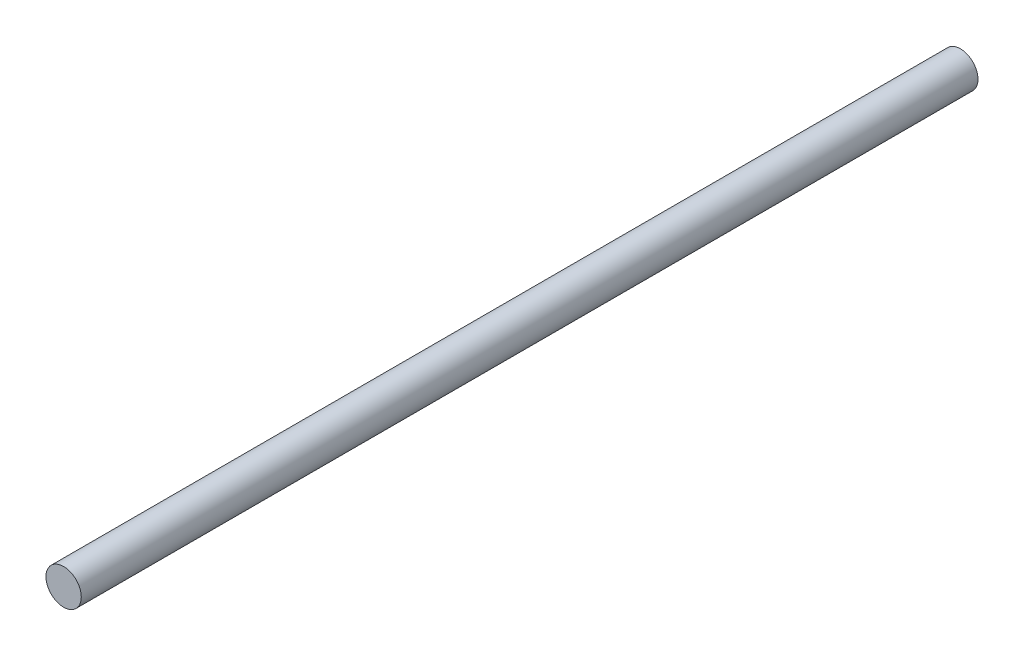
ISO-10303-21;
HEADER;
FILE_DESCRIPTION(('STEP AP214'),'2;1');
FILE_NAME('part.step','',(''),(''),'','','');
FILE_SCHEMA(('AUTOMOTIVE_DESIGN { 1 0 10303 214 1 1 1 1 }'));
ENDSEC;
DATA;
#1=APPLICATION_CONTEXT('core data for automotive mechanical design processes');
#2=APPLICATION_PROTOCOL_DEFINITION('international standard','automotive_design',2000,#1);
#3=PRODUCT_CONTEXT('',#1,'mechanical');
#4=PRODUCT('Part','Part','',(#3));
#5=PRODUCT_RELATED_PRODUCT_CATEGORY('part','',(#4));
#6=PRODUCT_DEFINITION_FORMATION('','',#4);
#7=PRODUCT_DEFINITION_CONTEXT('part definition',#1,'design');
#8=PRODUCT_DEFINITION('design','',#6,#7);
#9=PRODUCT_DEFINITION_SHAPE('','',#8);
#10=(LENGTH_UNIT() NAMED_UNIT(*) SI_UNIT(.MILLI.,.METRE.));
#11=(NAMED_UNIT(*) PLANE_ANGLE_UNIT() SI_UNIT($,.RADIAN.));
#12=(NAMED_UNIT(*) SI_UNIT($,.STERADIAN.) SOLID_ANGLE_UNIT());
#13=UNCERTAINTY_MEASURE_WITH_UNIT(LENGTH_MEASURE(1.E-05),#10,'distance_accuracy_value','');
#14=(GEOMETRIC_REPRESENTATION_CONTEXT(3) GLOBAL_UNCERTAINTY_ASSIGNED_CONTEXT((#13)) GLOBAL_UNIT_ASSIGNED_CONTEXT((#10,
#11,#12)) REPRESENTATION_CONTEXT('',''));
#15=CARTESIAN_POINT('',(0.,0.,0.));
#16=DIRECTION('',(0.,0.,1.));
#17=DIRECTION('',(1.,0.,0.));
#18=AXIS2_PLACEMENT_3D('',#15,#16,#17);
#19=CARTESIAN_POINT('',(0.,0.,127.));
#20=DIRECTION('',(0.,0.,-1.));
#21=DIRECTION('',(-1.,0.,0.));
#22=AXIS2_PLACEMENT_3D('',#19,#20,#21);
#23=CYLINDRICAL_SURFACE('',#22,2.5);
#24=CARTESIAN_POINT('',(0.,0.,127.));
#25=DIRECTION('',(0.,0.,1.));
#26=DIRECTION('',(1.,0.,0.));
#27=AXIS2_PLACEMENT_3D('',#24,#25,#26);
#28=CIRCLE('',#27,2.5);
#29=CARTESIAN_POINT('',(2.5,0.,127.));
#30=VERTEX_POINT('',#29);
#31=EDGE_CURVE('E10',#30,#30,#28,.T.);
#32=ORIENTED_EDGE('',*,*,#31,.F.);
#33=EDGE_LOOP('',(#32));
#34=FACE_BOUND('',#33,.T.);
#35=CARTESIAN_POINT('',(0.,0.,0.));
#36=DIRECTION('',(0.,0.,1.));
#37=DIRECTION('',(1.,0.,0.));
#38=AXIS2_PLACEMENT_3D('',#35,#36,#37);
#39=CIRCLE('',#38,2.5);
#40=CARTESIAN_POINT('',(2.5,0.,0.));
#41=VERTEX_POINT('',#40);
#42=EDGE_CURVE('E34',#41,#41,#39,.T.);
#43=ORIENTED_EDGE('',*,*,#42,.T.);
#44=EDGE_LOOP('',(#43));
#45=FACE_BOUND('',#44,.T.);
#46=ADVANCED_FACE('F31',(#34,#45),#23,.T.);
#47=CARTESIAN_POINT('',(0.,0.,127.));
#48=DIRECTION('',(0.,0.,1.));
#49=DIRECTION('',(1.,0.,0.));
#50=AXIS2_PLACEMENT_3D('',#47,#48,#49);
#51=PLANE('',#50);
#52=ORIENTED_EDGE('',*,*,#31,.T.);
#53=EDGE_LOOP('',(#52));
#54=FACE_BOUND('',#53,.T.);
#55=ADVANCED_FACE('F46',(#54),#51,.T.);
#56=CARTESIAN_POINT('',(0.,0.,0.));
#57=DIRECTION('',(0.,0.,1.));
#58=DIRECTION('',(1.,0.,0.));
#59=AXIS2_PLACEMENT_3D('',#56,#57,#58);
#60=PLANE('',#59);
#61=ORIENTED_EDGE('',*,*,#42,.F.);
#62=EDGE_LOOP('',(#61));
#63=FACE_BOUND('',#62,.T.);
#64=ADVANCED_FACE('F44',(#63),#60,.F.);
#65=CLOSED_SHELL('',(#46,#55,#64));
#66=MANIFOLD_SOLID_BREP('B2',#65);
#67=ADVANCED_BREP_SHAPE_REPRESENTATION('',(#18,#66),#14);
#68=SHAPE_DEFINITION_REPRESENTATION(#9,#67);
ENDSEC;
END-ISO-10303-21;
